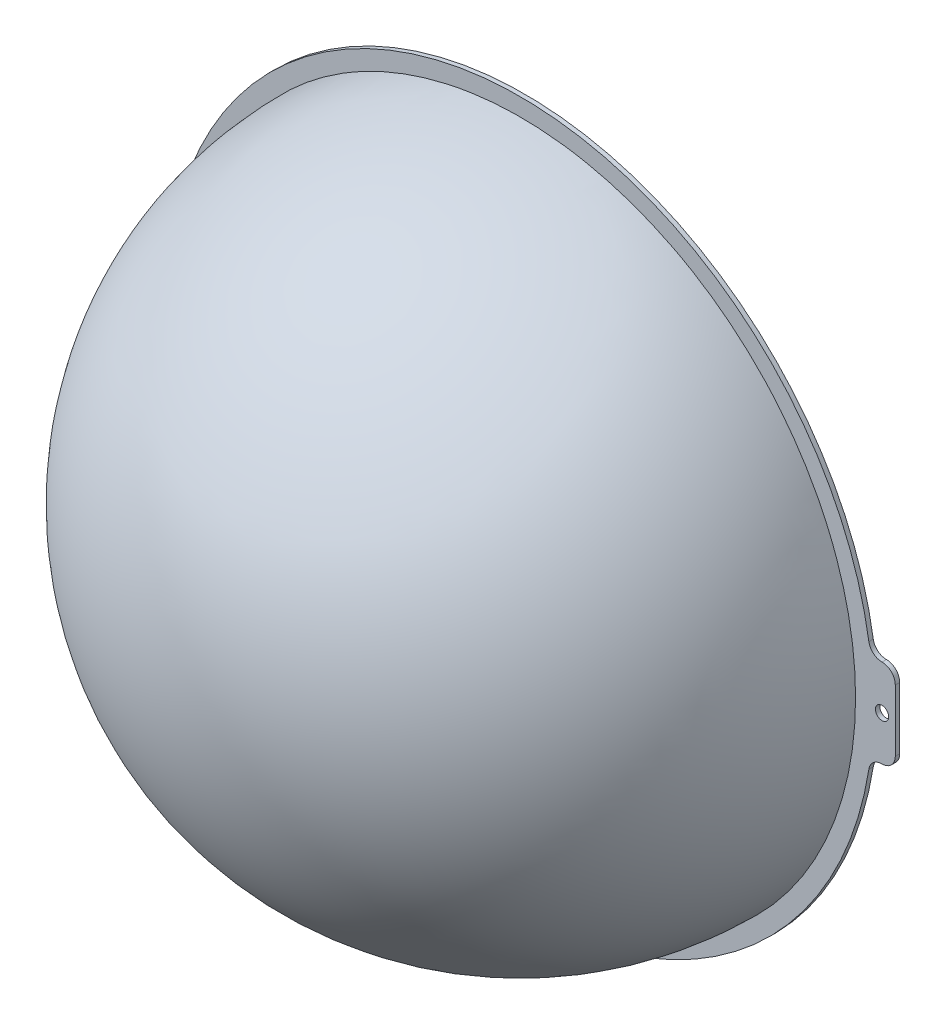
ISO-10303-21;
HEADER;
FILE_DESCRIPTION(('STEP AP214'),'2;1');
FILE_NAME('part.step','',(''),(''),'','','');
FILE_SCHEMA(('AUTOMOTIVE_DESIGN { 1 0 10303 214 1 1 1 1 }'));
ENDSEC;
DATA;
#1=APPLICATION_CONTEXT('core data for automotive mechanical design processes');
#2=APPLICATION_PROTOCOL_DEFINITION('international standard','automotive_design',2000,#1);
#3=PRODUCT_CONTEXT('',#1,'mechanical');
#4=PRODUCT('Part','Part','',(#3));
#5=PRODUCT_RELATED_PRODUCT_CATEGORY('part','',(#4));
#6=PRODUCT_DEFINITION_FORMATION('','',#4);
#7=PRODUCT_DEFINITION_CONTEXT('part definition',#1,'design');
#8=PRODUCT_DEFINITION('design','',#6,#7);
#9=PRODUCT_DEFINITION_SHAPE('','',#8);
#10=(LENGTH_UNIT() NAMED_UNIT(*) SI_UNIT(.MILLI.,.METRE.));
#11=(NAMED_UNIT(*) PLANE_ANGLE_UNIT() SI_UNIT($,.RADIAN.));
#12=(NAMED_UNIT(*) SI_UNIT($,.STERADIAN.) SOLID_ANGLE_UNIT());
#13=UNCERTAINTY_MEASURE_WITH_UNIT(LENGTH_MEASURE(1.E-05),#10,'distance_accuracy_value','');
#14=(GEOMETRIC_REPRESENTATION_CONTEXT(3) GLOBAL_UNCERTAINTY_ASSIGNED_CONTEXT((#13)) GLOBAL_UNIT_ASSIGNED_CONTEXT((#10,
#11,#12)) REPRESENTATION_CONTEXT('',''));
#15=CARTESIAN_POINT('',(0.,0.,0.));
#16=DIRECTION('',(0.,0.,1.));
#17=DIRECTION('',(1.,0.,0.));
#18=AXIS2_PLACEMENT_3D('',#15,#16,#17);
#19=CARTESIAN_POINT('',(-4.547474E-13,667.332012286218,-368.857743681072));
#20=DIRECTION('',(-1.,0.,0.));
#21=DIRECTION('',(0.,-1.,0.));
#22=AXIS2_PLACEMENT_3D('',#19,#20,#21);
#23=SPHERICAL_SURFACE('',#22,75.);
#24=CARTESIAN_POINT('',(-4.547474E-13,667.332012286218,-368.857743681072));
#25=DIRECTION('',(0.,0.,1.));
#26=DIRECTION('',(1.,0.,0.));
#27=AXIS2_PLACEMENT_3D('',#24,#25,#26);
#28=CIRCLE('',#27,75.);
#29=CARTESIAN_POINT('',(74.9999999999995,667.332012286218,-368.857743681072));
#30=VERTEX_POINT('',#29);
#31=CARTESIAN_POINT('',(-75.0000000000005,667.332012286218,-368.857743681072));
#32=VERTEX_POINT('',#31);
#33=EDGE_CURVE('E216',#30,#32,#28,.F.);
#34=ORIENTED_EDGE('',*,*,#33,.T.);
#35=CARTESIAN_POINT('',(-4.547474E-13,667.332012286218,-368.857743681072));
#36=DIRECTION('',(0.,0.,1.));
#37=DIRECTION('',(1.,0.,0.));
#38=AXIS2_PLACEMENT_3D('',#35,#36,#37);
#39=CIRCLE('',#38,75.);
#40=EDGE_CURVE('E213',#32,#30,#39,.F.);
#41=ORIENTED_EDGE('',*,*,#40,.T.);
#42=EDGE_LOOP('',(#34,#41));
#43=FACE_BOUND('',#42,.T.);
#44=ADVANCED_FACE('F17',(#43),#23,.F.);
#45=CARTESIAN_POINT('',(-4.547474E-13,667.332012286218,-369.357743681072));
#46=DIRECTION('',(0.,0.,1.));
#47=DIRECTION('',(1.,0.,0.));
#48=AXIS2_PLACEMENT_3D('',#45,#46,#47);
#49=CYLINDRICAL_SURFACE('',#48,75.);
#50=CARTESIAN_POINT('',(-4.547474E-13,667.332012286218,-369.857743681072));
#51=DIRECTION('',(0.,0.,1.));
#52=DIRECTION('',(1.,0.,0.));
#53=AXIS2_PLACEMENT_3D('',#50,#51,#52);
#54=CIRCLE('',#53,75.);
#55=CARTESIAN_POINT('',(74.9999999999995,667.332012286218,-369.857743681072));
#56=VERTEX_POINT('',#55);
#57=EDGE_CURVE('E21',#56,#56,#54,.T.);
#58=ORIENTED_EDGE('',*,*,#57,.F.);
#59=EDGE_LOOP('',(#58));
#60=FACE_BOUND('',#59,.T.);
#61=ORIENTED_EDGE('',*,*,#40,.F.);
#62=ORIENTED_EDGE('',*,*,#33,.F.);
#63=EDGE_LOOP('',(#61,#62));
#64=FACE_BOUND('',#63,.T.);
#65=ADVANCED_FACE('F312',(#60,#64),#49,.F.);
#66=CARTESIAN_POINT('',(-4.547474E-13,667.332012286218,-369.857743681072));
#67=DIRECTION('',(0.,0.,-1.));
#68=DIRECTION('',(-1.,0.,0.));
#69=AXIS2_PLACEMENT_3D('',#66,#67,#68);
#70=PLANE('',#69);
#71=CARTESIAN_POINT('',(-82.0000000000005,667.332012286217,-369.857743681072));
#72=DIRECTION('',(0.,0.,1.));
#73=DIRECTION('',(1.,0.,0.));
#74=AXIS2_PLACEMENT_3D('',#71,#72,#73);
#75=CIRCLE('',#74,1.5);
#76=CARTESIAN_POINT('',(-80.5000000000005,667.332012286217,-369.857743681072));
#77=VERTEX_POINT('',#76);
#78=EDGE_CURVE('E390',#77,#77,#75,.T.);
#79=ORIENTED_EDGE('',*,*,#78,.T.);
#80=EDGE_LOOP('',(#79));
#81=FACE_BOUND('',#80,.T.);
#82=ORIENTED_EDGE('',*,*,#57,.T.);
#83=EDGE_LOOP('',(#82));
#84=FACE_BOUND('',#83,.T.);
#85=CARTESIAN_POINT('',(81.9999999999995,667.332012286217,-369.857743681072));
#86=DIRECTION('',(0.,0.,1.));
#87=DIRECTION('',(1.,0.,0.));
#88=AXIS2_PLACEMENT_3D('',#85,#86,#87);
#89=CIRCLE('',#88,1.5);
#90=CARTESIAN_POINT('',(83.4999999999995,667.332012286217,-369.857743681072));
#91=VERTEX_POINT('',#90);
#92=EDGE_CURVE('E160',#91,#91,#89,.T.);
#93=ORIENTED_EDGE('',*,*,#92,.T.);
#94=EDGE_LOOP('',(#93));
#95=FACE_BOUND('',#94,.T.);
#96=DIRECTION('',(1.,0.,0.));
#97=VECTOR('',#96,1.);
#98=CARTESIAN_POINT('',(79.9999999999995,657.332012286217,-369.857743681072));
#99=LINE('',#98,#97);
#100=CARTESIAN_POINT('',(81.9999999999995,657.332012286217,-369.857743681072));
#101=VERTEX_POINT('',#100);
#102=CARTESIAN_POINT('',(81.9756061276763,657.332012286217,-369.857743681072));
#103=VERTEX_POINT('',#102);
#104=EDGE_CURVE('E178',#101,#103,#99,.F.);
#105=ORIENTED_EDGE('',*,*,#104,.T.);
#106=CARTESIAN_POINT('',(81.9756061276763,654.332012286217,-369.857743681072));
#107=DIRECTION('',(0.,0.,1.));
#108=DIRECTION('',(1.,0.,0.));
#109=AXIS2_PLACEMENT_3D('',#106,#107,#108);
#110=CIRCLE('',#109,3.);
#111=CARTESIAN_POINT('',(79.0126324122182,654.80189180429,-369.857743681072));
#112=VERTEX_POINT('',#111);
#113=EDGE_CURVE('E175',#103,#112,#110,.T.);
#114=ORIENTED_EDGE('',*,*,#113,.T.);
#115=CARTESIAN_POINT('',(-4.547474E-13,667.332012286218,-369.857743681072));
#116=DIRECTION('',(0.,0.,1.));
#117=DIRECTION('',(1.,0.,0.));
#118=AXIS2_PLACEMENT_3D('',#115,#116,#117);
#119=CIRCLE('',#118,80.);
#120=CARTESIAN_POINT('',(-79.012632412219,654.80189180429,-369.857743681072));
#121=VERTEX_POINT('',#120);
#122=EDGE_CURVE('E180',#121,#112,#119,.T.);
#123=ORIENTED_EDGE('',*,*,#122,.F.);
#124=CARTESIAN_POINT('',(-81.9756061276772,654.332012286217,-369.857743681072));
#125=DIRECTION('',(0.,0.,-1.));
#126=DIRECTION('',(-1.,0.,0.));
#127=AXIS2_PLACEMENT_3D('',#124,#125,#126);
#128=CIRCLE('',#127,3.);
#129=CARTESIAN_POINT('',(-81.9756061276772,657.332012286217,-369.857743681072));
#130=VERTEX_POINT('',#129);
#131=EDGE_CURVE('E183',#121,#130,#128,.F.);
#132=ORIENTED_EDGE('',*,*,#131,.T.);
#133=DIRECTION('',(1.,0.,0.));
#134=VECTOR('',#133,1.);
#135=CARTESIAN_POINT('',(-81.9756061276772,657.332012286217,-369.857743681072));
#136=LINE('',#135,#134);
#137=CARTESIAN_POINT('',(-82.0000000000005,657.332012286217,-369.857743681072));
#138=VERTEX_POINT('',#137);
#139=EDGE_CURVE('E190',#130,#138,#136,.F.);
#140=ORIENTED_EDGE('',*,*,#139,.T.);
#141=CARTESIAN_POINT('',(-82.0000000000005,660.332012286217,-369.857743681072));
#142=DIRECTION('',(0.,0.,1.));
#143=DIRECTION('',(1.,0.,0.));
#144=AXIS2_PLACEMENT_3D('',#141,#142,#143);
#145=CIRCLE('',#144,3.);
#146=CARTESIAN_POINT('',(-85.0000000000005,660.332012286217,-369.857743681072));
#147=VERTEX_POINT('',#146);
#148=EDGE_CURVE('E187',#147,#138,#145,.T.);
#149=ORIENTED_EDGE('',*,*,#148,.F.);
#150=DIRECTION('',(0.,1.,0.));
#151=VECTOR('',#150,1.);
#152=CARTESIAN_POINT('',(-85.0000000000005,660.332012286217,-369.857743681072));
#153=LINE('',#152,#151);
#154=CARTESIAN_POINT('',(-85.0000000000005,674.332012286217,-369.857743681072));
#155=VERTEX_POINT('',#154);
#156=EDGE_CURVE('E210',#147,#155,#153,.T.);
#157=ORIENTED_EDGE('',*,*,#156,.T.);
#158=CARTESIAN_POINT('',(-82.0000000000005,674.332012286217,-369.857743681072));
#159=DIRECTION('',(0.,0.,-1.));
#160=DIRECTION('',(-1.,0.,0.));
#161=AXIS2_PLACEMENT_3D('',#158,#159,#160);
#162=CIRCLE('',#161,3.);
#163=CARTESIAN_POINT('',(-82.0000000000005,677.332012286217,-369.857743681072));
#164=VERTEX_POINT('',#163);
#165=EDGE_CURVE('E192',#164,#155,#162,.F.);
#166=ORIENTED_EDGE('',*,*,#165,.F.);
#167=DIRECTION('',(1.,0.,0.));
#168=VECTOR('',#167,1.);
#169=CARTESIAN_POINT('',(-81.9756061276773,677.332012286217,-369.857743681072));
#170=LINE('',#169,#168);
#171=CARTESIAN_POINT('',(-81.9756061276773,677.332012286217,-369.857743681072));
#172=VERTEX_POINT('',#171);
#173=EDGE_CURVE('E197',#164,#172,#170,.T.);
#174=ORIENTED_EDGE('',*,*,#173,.T.);
#175=CARTESIAN_POINT('',(-81.9756061276773,680.332012286217,-369.857743681072));
#176=DIRECTION('',(0.,0.,1.));
#177=DIRECTION('',(1.,0.,0.));
#178=AXIS2_PLACEMENT_3D('',#175,#176,#177);
#179=CIRCLE('',#178,3.);
#180=CARTESIAN_POINT('',(-79.0126324122191,679.862132768145,-369.857743681072));
#181=VERTEX_POINT('',#180);
#182=EDGE_CURVE('E142',#172,#181,#179,.T.);
#183=ORIENTED_EDGE('',*,*,#182,.T.);
#184=CARTESIAN_POINT('',(-4.547474E-13,667.332012286218,-369.857743681072));
#185=DIRECTION('',(0.,0.,1.));
#186=DIRECTION('',(1.,0.,0.));
#187=AXIS2_PLACEMENT_3D('',#184,#185,#186);
#188=CIRCLE('',#187,80.);
#189=CARTESIAN_POINT('',(79.0126324122181,679.862132768145,-369.857743681072));
#190=VERTEX_POINT('',#189);
#191=EDGE_CURVE('E135',#190,#181,#188,.T.);
#192=ORIENTED_EDGE('',*,*,#191,.F.);
#193=CARTESIAN_POINT('',(81.9756061276763,680.332012286217,-369.857743681072));
#194=DIRECTION('',(0.,0.,-1.));
#195=DIRECTION('',(-1.,0.,0.));
#196=AXIS2_PLACEMENT_3D('',#193,#194,#195);
#197=CIRCLE('',#196,3.);
#198=CARTESIAN_POINT('',(81.9756061276763,677.332012286217,-369.857743681072));
#199=VERTEX_POINT('',#198);
#200=EDGE_CURVE('E139',#190,#199,#197,.F.);
#201=ORIENTED_EDGE('',*,*,#200,.T.);
#202=DIRECTION('',(1.,0.,0.));
#203=VECTOR('',#202,1.);
#204=CARTESIAN_POINT('',(79.9999999999995,677.332012286217,-369.857743681072));
#205=LINE('',#204,#203);
#206=CARTESIAN_POINT('',(81.9999999999995,677.332012286217,-369.857743681072));
#207=VERTEX_POINT('',#206);
#208=EDGE_CURVE('E204',#199,#207,#205,.T.);
#209=ORIENTED_EDGE('',*,*,#208,.T.);
#210=CARTESIAN_POINT('',(81.9999999999995,674.332012286217,-369.857743681072));
#211=DIRECTION('',(0.,0.,-1.));
#212=DIRECTION('',(-1.,0.,0.));
#213=AXIS2_PLACEMENT_3D('',#210,#211,#212);
#214=CIRCLE('',#213,3.);
#215=CARTESIAN_POINT('',(84.9999999999995,674.332012286217,-369.857743681072));
#216=VERTEX_POINT('',#215);
#217=EDGE_CURVE('E165',#216,#207,#214,.F.);
#218=ORIENTED_EDGE('',*,*,#217,.F.);
#219=DIRECTION('',(0.,1.,0.));
#220=VECTOR('',#219,1.);
#221=CARTESIAN_POINT('',(84.9999999999995,667.332012286217,-369.857743681072));
#222=LINE('',#221,#220);
#223=CARTESIAN_POINT('',(84.9999999999995,660.332012286217,-369.857743681072));
#224=VERTEX_POINT('',#223);
#225=EDGE_CURVE('E173',#216,#224,#222,.F.);
#226=ORIENTED_EDGE('',*,*,#225,.T.);
#227=CARTESIAN_POINT('',(81.9999999999995,660.332012286217,-369.857743681072));
#228=DIRECTION('',(0.,0.,1.));
#229=DIRECTION('',(0.,-1.,0.));
#230=AXIS2_PLACEMENT_3D('',#227,#228,#229);
#231=CIRCLE('',#230,3.00000000000002);
#232=EDGE_CURVE('E170',#101,#224,#231,.T.);
#233=ORIENTED_EDGE('',*,*,#232,.F.);
#234=EDGE_LOOP('',(#105,#114,#123,#132,#140,#149,#157,#166,#174,#183,#192,#201,#209,#218,#226,#233));
#235=FACE_BOUND('',#234,.T.);
#236=ADVANCED_FACE('F137',(#81,#84,#95,#235),#70,.T.);
#237=CARTESIAN_POINT('',(-4.547474E-13,667.332012286218,-369.357743681072));
#238=DIRECTION('',(0.,0.,1.));
#239=DIRECTION('',(1.,0.,0.));
#240=AXIS2_PLACEMENT_3D('',#237,#238,#239);
#241=CYLINDRICAL_SURFACE('',#240,80.);
#242=DIRECTION('',(0.,0.,1.));
#243=VECTOR('',#242,1.);
#244=CARTESIAN_POINT('',(-79.0126324122191,679.862132768145,-369.357743681072));
#245=LINE('',#244,#243);
#246=CARTESIAN_POINT('',(-79.0126324122191,679.862132768145,-368.857743681072));
#247=VERTEX_POINT('',#246);
#248=EDGE_CURVE('E145',#181,#247,#245,.T.);
#249=ORIENTED_EDGE('',*,*,#248,.T.);
#250=CARTESIAN_POINT('',(-4.547474E-13,667.332012286218,-368.857743681072));
#251=DIRECTION('',(0.,0.,1.));
#252=DIRECTION('',(1.,0.,0.));
#253=AXIS2_PLACEMENT_3D('',#250,#251,#252);
#254=CIRCLE('',#253,80.);
#255=CARTESIAN_POINT('',(79.0126324122181,679.862132768145,-368.857743681072));
#256=VERTEX_POINT('',#255);
#257=EDGE_CURVE('E150',#256,#247,#254,.T.);
#258=ORIENTED_EDGE('',*,*,#257,.F.);
#259=DIRECTION('',(0.,0.,-1.));
#260=VECTOR('',#259,1.);
#261=CARTESIAN_POINT('',(79.0126324122181,679.862132768145,-369.357743681072));
#262=LINE('',#261,#260);
#263=EDGE_CURVE('E147',#256,#190,#262,.T.);
#264=ORIENTED_EDGE('',*,*,#263,.T.);
#265=ORIENTED_EDGE('',*,*,#191,.T.);
#266=EDGE_LOOP('',(#249,#258,#264,#265));
#267=FACE_BOUND('',#266,.T.);
#268=ADVANCED_FACE('F148',(#267),#241,.T.);
#269=CARTESIAN_POINT('',(-81.9756061276773,680.332012286217,-369.357743681072));
#270=DIRECTION('',(0.,0.,1.));
#271=DIRECTION('',(1.,0.,0.));
#272=AXIS2_PLACEMENT_3D('',#269,#270,#271);
#273=CYLINDRICAL_SURFACE('',#272,3.);
#274=DIRECTION('',(0.,0.,-1.));
#275=VECTOR('',#274,1.);
#276=CARTESIAN_POINT('',(-81.9756061276773,677.332012286217,-369.857743681072));
#277=LINE('',#276,#275);
#278=CARTESIAN_POINT('',(-81.9756061276773,677.332012286217,-368.857743681072));
#279=VERTEX_POINT('',#278);
#280=EDGE_CURVE('E196',#172,#279,#277,.F.);
#281=ORIENTED_EDGE('',*,*,#280,.T.);
#282=CARTESIAN_POINT('',(-81.9756061276773,680.332012286217,-368.857743681072));
#283=DIRECTION('',(0.,0.,1.));
#284=DIRECTION('',(1.,0.,0.));
#285=AXIS2_PLACEMENT_3D('',#282,#283,#284);
#286=CIRCLE('',#285,3.);
#287=EDGE_CURVE('E362',#247,#279,#286,.F.);
#288=ORIENTED_EDGE('',*,*,#287,.F.);
#289=ORIENTED_EDGE('',*,*,#248,.F.);
#290=ORIENTED_EDGE('',*,*,#182,.F.);
#291=EDGE_LOOP('',(#281,#288,#289,#290));
#292=FACE_BOUND('',#291,.T.);
#293=ADVANCED_FACE('F304',(#292),#273,.F.);
#294=CARTESIAN_POINT('',(-81.9756061276773,677.332012286217,-369.857743681072));
#295=DIRECTION('',(0.,-1.,0.));
#296=DIRECTION('',(0.,0.,-1.));
#297=AXIS2_PLACEMENT_3D('',#294,#295,#296);
#298=PLANE('',#297);
#299=ORIENTED_EDGE('',*,*,#173,.F.);
#300=DIRECTION('',(0.,0.,-1.));
#301=VECTOR('',#300,1.);
#302=CARTESIAN_POINT('',(-82.0000000000005,677.332012286217,-369.107743681072));
#303=LINE('',#302,#301);
#304=CARTESIAN_POINT('',(-82.0000000000005,677.332012286217,-368.857743681072));
#305=VERTEX_POINT('',#304);
#306=EDGE_CURVE('E195',#305,#164,#303,.T.);
#307=ORIENTED_EDGE('',*,*,#306,.F.);
#308=DIRECTION('',(1.,0.,0.));
#309=VECTOR('',#308,1.);
#310=CARTESIAN_POINT('',(-4.547474E-13,677.332012286217,-368.857743681072));
#311=LINE('',#310,#309);
#312=EDGE_CURVE('E360',#279,#305,#311,.F.);
#313=ORIENTED_EDGE('',*,*,#312,.F.);
#314=ORIENTED_EDGE('',*,*,#280,.F.);
#315=EDGE_LOOP('',(#299,#307,#313,#314));
#316=FACE_BOUND('',#315,.T.);
#317=ADVANCED_FACE('F300',(#316),#298,.F.);
#318=CARTESIAN_POINT('',(-82.0000000000005,674.332012286217,-369.107743681072));
#319=DIRECTION('',(0.,0.,-1.));
#320=DIRECTION('',(-1.,0.,0.));
#321=AXIS2_PLACEMENT_3D('',#318,#319,#320);
#322=CYLINDRICAL_SURFACE('',#321,3.);
#323=CARTESIAN_POINT('',(-82.0000000000005,674.332012286217,-368.857743681072));
#324=DIRECTION('',(0.,0.,-1.));
#325=DIRECTION('',(-1.,0.,0.));
#326=AXIS2_PLACEMENT_3D('',#323,#324,#325);
#327=CIRCLE('',#326,3.);
#328=CARTESIAN_POINT('',(-85.0000000000005,674.332012286217,-368.857743681072));
#329=VERTEX_POINT('',#328);
#330=EDGE_CURVE('E359',#305,#329,#327,.F.);
#331=ORIENTED_EDGE('',*,*,#330,.F.);
#332=ORIENTED_EDGE('',*,*,#306,.T.);
#333=ORIENTED_EDGE('',*,*,#165,.T.);
#334=DIRECTION('',(0.,0.,-1.));
#335=VECTOR('',#334,1.);
#336=CARTESIAN_POINT('',(-85.0000000000005,674.332012286217,-368.857743681072));
#337=LINE('',#336,#335);
#338=EDGE_CURVE('E211',#155,#329,#337,.F.);
#339=ORIENTED_EDGE('',*,*,#338,.T.);
#340=EDGE_LOOP('',(#331,#332,#333,#339));
#341=FACE_BOUND('',#340,.T.);
#342=ADVANCED_FACE('F296',(#341),#322,.T.);
#343=CARTESIAN_POINT('',(-85.0000000000005,660.332012286217,-368.857743681072));
#344=DIRECTION('',(1.,0.,0.));
#345=DIRECTION('',(0.,0.,-1.));
#346=AXIS2_PLACEMENT_3D('',#343,#344,#345);
#347=PLANE('',#346);
#348=DIRECTION('',(0.,1.,0.));
#349=VECTOR('',#348,1.);
#350=CARTESIAN_POINT('',(-85.0000000000005,667.332012286218,-368.857743681072));
#351=LINE('',#350,#349);
#352=CARTESIAN_POINT('',(-85.0000000000005,660.332012286217,-368.857743681072));
#353=VERTEX_POINT('',#352);
#354=EDGE_CURVE('E356',#329,#353,#351,.F.);
#355=ORIENTED_EDGE('',*,*,#354,.F.);
#356=ORIENTED_EDGE('',*,*,#338,.F.);
#357=ORIENTED_EDGE('',*,*,#156,.F.);
#358=DIRECTION('',(0.,0.,1.));
#359=VECTOR('',#358,1.);
#360=CARTESIAN_POINT('',(-85.0000000000005,660.332012286217,-369.107743681072));
#361=LINE('',#360,#359);
#362=EDGE_CURVE('E191',#353,#147,#361,.F.);
#363=ORIENTED_EDGE('',*,*,#362,.F.);
#364=EDGE_LOOP('',(#355,#356,#357,#363));
#365=FACE_BOUND('',#364,.T.);
#366=ADVANCED_FACE('F292',(#365),#347,.F.);
#367=CARTESIAN_POINT('',(-82.0000000000005,660.332012286217,-369.107743681072));
#368=DIRECTION('',(0.,0.,1.));
#369=DIRECTION('',(1.,0.,0.));
#370=AXIS2_PLACEMENT_3D('',#367,#368,#369);
#371=CYLINDRICAL_SURFACE('',#370,3.);
#372=ORIENTED_EDGE('',*,*,#148,.T.);
#373=DIRECTION('',(0.,0.,1.));
#374=VECTOR('',#373,1.);
#375=CARTESIAN_POINT('',(-82.0000000000005,657.332012286217,-368.857743681072));
#376=LINE('',#375,#374);
#377=CARTESIAN_POINT('',(-82.0000000000005,657.332012286217,-368.857743681072));
#378=VERTEX_POINT('',#377);
#379=EDGE_CURVE('E186',#138,#378,#376,.T.);
#380=ORIENTED_EDGE('',*,*,#379,.T.);
#381=CARTESIAN_POINT('',(-82.0000000000005,660.332012286217,-368.857743681072));
#382=DIRECTION('',(0.,0.,1.));
#383=DIRECTION('',(1.,0.,0.));
#384=AXIS2_PLACEMENT_3D('',#381,#382,#383);
#385=CIRCLE('',#384,3.);
#386=EDGE_CURVE('E355',#353,#378,#385,.T.);
#387=ORIENTED_EDGE('',*,*,#386,.F.);
#388=ORIENTED_EDGE('',*,*,#362,.T.);
#389=EDGE_LOOP('',(#372,#380,#387,#388));
#390=FACE_BOUND('',#389,.T.);
#391=ADVANCED_FACE('F288',(#390),#371,.T.);
#392=CARTESIAN_POINT('',(-81.9756061276772,657.332012286217,-368.857743681072));
#393=DIRECTION('',(0.,1.,0.));
#394=DIRECTION('',(0.,0.,1.));
#395=AXIS2_PLACEMENT_3D('',#392,#393,#394);
#396=PLANE('',#395);
#397=DIRECTION('',(1.,0.,0.));
#398=VECTOR('',#397,1.);
#399=CARTESIAN_POINT('',(-4.547474E-13,657.332012286217,-368.857743681072));
#400=LINE('',#399,#398);
#401=CARTESIAN_POINT('',(-81.9756061276772,657.332012286217,-368.857743681072));
#402=VERTEX_POINT('',#401);
#403=EDGE_CURVE('E351',#378,#402,#400,.T.);
#404=ORIENTED_EDGE('',*,*,#403,.F.);
#405=ORIENTED_EDGE('',*,*,#379,.F.);
#406=ORIENTED_EDGE('',*,*,#139,.F.);
#407=DIRECTION('',(0.,0.,-1.));
#408=VECTOR('',#407,1.);
#409=CARTESIAN_POINT('',(-81.9756061276772,657.332012286217,-369.357743681072));
#410=LINE('',#409,#408);
#411=EDGE_CURVE('E185',#130,#402,#410,.F.);
#412=ORIENTED_EDGE('',*,*,#411,.T.);
#413=EDGE_LOOP('',(#404,#405,#406,#412));
#414=FACE_BOUND('',#413,.T.);
#415=ADVANCED_FACE('F284',(#414),#396,.F.);
#416=CARTESIAN_POINT('',(-81.9756061276772,654.332012286217,-369.357743681072));
#417=DIRECTION('',(0.,0.,-1.));
#418=DIRECTION('',(-1.,0.,0.));
#419=AXIS2_PLACEMENT_3D('',#416,#417,#418);
#420=CYLINDRICAL_SURFACE('',#419,3.);
#421=ORIENTED_EDGE('',*,*,#411,.F.);
#422=ORIENTED_EDGE('',*,*,#131,.F.);
#423=DIRECTION('',(0.,0.,1.));
#424=VECTOR('',#423,1.);
#425=CARTESIAN_POINT('',(-79.012632412219,654.80189180429,-369.357743681072));
#426=LINE('',#425,#424);
#427=CARTESIAN_POINT('',(-79.012632412219,654.80189180429,-368.857743681072));
#428=VERTEX_POINT('',#427);
#429=EDGE_CURVE('E182',#428,#121,#426,.F.);
#430=ORIENTED_EDGE('',*,*,#429,.F.);
#431=CARTESIAN_POINT('',(-81.9756061276772,654.332012286217,-368.857743681072));
#432=DIRECTION('',(0.,0.,-1.));
#433=DIRECTION('',(-1.,0.,0.));
#434=AXIS2_PLACEMENT_3D('',#431,#432,#433);
#435=CIRCLE('',#434,3.);
#436=EDGE_CURVE('E354',#402,#428,#435,.T.);
#437=ORIENTED_EDGE('',*,*,#436,.F.);
#438=EDGE_LOOP('',(#421,#422,#430,#437));
#439=FACE_BOUND('',#438,.T.);
#440=ADVANCED_FACE('F280',(#439),#420,.F.);
#441=CARTESIAN_POINT('',(-4.547474E-13,667.332012286218,-369.357743681072));
#442=DIRECTION('',(0.,0.,1.));
#443=DIRECTION('',(1.,0.,0.));
#444=AXIS2_PLACEMENT_3D('',#441,#442,#443);
#445=CYLINDRICAL_SURFACE('',#444,80.);
#446=ORIENTED_EDGE('',*,*,#429,.T.);
#447=ORIENTED_EDGE('',*,*,#122,.T.);
#448=DIRECTION('',(0.,0.,1.));
#449=VECTOR('',#448,1.);
#450=CARTESIAN_POINT('',(79.0126324122182,654.80189180429,-369.357743681072));
#451=LINE('',#450,#449);
#452=CARTESIAN_POINT('',(79.0126324122182,654.80189180429,-368.857743681072));
#453=VERTEX_POINT('',#452);
#454=EDGE_CURVE('E179',#112,#453,#451,.T.);
#455=ORIENTED_EDGE('',*,*,#454,.T.);
#456=CARTESIAN_POINT('',(-4.547474E-13,667.332012286218,-368.857743681072));
#457=DIRECTION('',(0.,0.,1.));
#458=DIRECTION('',(1.,0.,0.));
#459=AXIS2_PLACEMENT_3D('',#456,#457,#458);
#460=CIRCLE('',#459,80.);
#461=EDGE_CURVE('E399',#428,#453,#460,.T.);
#462=ORIENTED_EDGE('',*,*,#461,.F.);
#463=EDGE_LOOP('',(#446,#447,#455,#462));
#464=FACE_BOUND('',#463,.T.);
#465=ADVANCED_FACE('F276',(#464),#445,.T.);
#466=CARTESIAN_POINT('',(81.9756061276763,654.332012286217,-369.357743681072));
#467=DIRECTION('',(0.,0.,1.));
#468=DIRECTION('',(1.,0.,0.));
#469=AXIS2_PLACEMENT_3D('',#466,#467,#468);
#470=CYLINDRICAL_SURFACE('',#469,3.);
#471=DIRECTION('',(0.,0.,1.));
#472=VECTOR('',#471,1.);
#473=CARTESIAN_POINT('',(81.9756061276763,657.332012286217,-369.107743681072));
#474=LINE('',#473,#472);
#475=CARTESIAN_POINT('',(81.9756061276763,657.332012286217,-368.857743681072));
#476=VERTEX_POINT('',#475);
#477=EDGE_CURVE('E208',#103,#476,#474,.T.);
#478=ORIENTED_EDGE('',*,*,#477,.T.);
#479=CARTESIAN_POINT('',(81.9756061276763,654.332012286217,-368.857743681072));
#480=DIRECTION('',(0.,0.,1.));
#481=DIRECTION('',(1.,0.,0.));
#482=AXIS2_PLACEMENT_3D('',#479,#480,#481);
#483=CIRCLE('',#482,3.);
#484=EDGE_CURVE('E350',#453,#476,#483,.F.);
#485=ORIENTED_EDGE('',*,*,#484,.F.);
#486=ORIENTED_EDGE('',*,*,#454,.F.);
#487=ORIENTED_EDGE('',*,*,#113,.F.);
#488=EDGE_LOOP('',(#478,#485,#486,#487));
#489=FACE_BOUND('',#488,.T.);
#490=ADVANCED_FACE('F272',(#489),#470,.F.);
#491=CARTESIAN_POINT('',(79.9999999999995,657.332012286217,-369.107743681072));
#492=DIRECTION('',(0.,1.,0.));
#493=DIRECTION('',(0.,0.,1.));
#494=AXIS2_PLACEMENT_3D('',#491,#492,#493);
#495=PLANE('',#494);
#496=ORIENTED_EDGE('',*,*,#104,.F.);
#497=DIRECTION('',(0.,0.,1.));
#498=VECTOR('',#497,1.);
#499=CARTESIAN_POINT('',(81.9999999999995,657.332012286217,-369.857743681072));
#500=LINE('',#499,#498);
#501=CARTESIAN_POINT('',(81.9999999999995,657.332012286217,-368.857743681072));
#502=VERTEX_POINT('',#501);
#503=EDGE_CURVE('E174',#502,#101,#500,.F.);
#504=ORIENTED_EDGE('',*,*,#503,.F.);
#505=DIRECTION('',(1.,0.,0.));
#506=VECTOR('',#505,1.);
#507=CARTESIAN_POINT('',(-4.547474E-13,657.332012286217,-368.857743681072));
#508=LINE('',#507,#506);
#509=EDGE_CURVE('E347',#476,#502,#508,.T.);
#510=ORIENTED_EDGE('',*,*,#509,.F.);
#511=ORIENTED_EDGE('',*,*,#477,.F.);
#512=EDGE_LOOP('',(#496,#504,#510,#511));
#513=FACE_BOUND('',#512,.T.);
#514=ADVANCED_FACE('F268',(#513),#495,.F.);
#515=CARTESIAN_POINT('',(81.9999999999995,660.332012286217,-369.857743681072));
#516=DIRECTION('',(0.,0.,1.));
#517=DIRECTION('',(0.,-1.,0.));
#518=AXIS2_PLACEMENT_3D('',#515,#516,#517);
#519=CYLINDRICAL_SURFACE('',#518,3.00000000000002);
#520=ORIENTED_EDGE('',*,*,#232,.T.);
#521=DIRECTION('',(0.,0.,1.));
#522=VECTOR('',#521,1.);
#523=CARTESIAN_POINT('',(84.9999999999995,660.332012286217,-369.107743681072));
#524=LINE('',#523,#522);
#525=CARTESIAN_POINT('',(84.9999999999995,660.332012286217,-368.857743681072));
#526=VERTEX_POINT('',#525);
#527=EDGE_CURVE('E169',#224,#526,#524,.T.);
#528=ORIENTED_EDGE('',*,*,#527,.T.);
#529=CARTESIAN_POINT('',(81.9999999999995,660.332012286217,-368.857743681072));
#530=DIRECTION('',(0.,0.,1.));
#531=DIRECTION('',(0.,-1.,0.));
#532=AXIS2_PLACEMENT_3D('',#529,#530,#531);
#533=CIRCLE('',#532,3.00000000000002);
#534=EDGE_CURVE('E346',#502,#526,#533,.T.);
#535=ORIENTED_EDGE('',*,*,#534,.F.);
#536=ORIENTED_EDGE('',*,*,#503,.T.);
#537=EDGE_LOOP('',(#520,#528,#535,#536));
#538=FACE_BOUND('',#537,.T.);
#539=ADVANCED_FACE('F264',(#538),#519,.T.);
#540=CARTESIAN_POINT('',(84.9999999999995,667.332012286217,-369.107743681072));
#541=DIRECTION('',(-1.,0.,0.));
#542=DIRECTION('',(0.,0.,1.));
#543=AXIS2_PLACEMENT_3D('',#540,#541,#542);
#544=PLANE('',#543);
#545=ORIENTED_EDGE('',*,*,#225,.F.);
#546=DIRECTION('',(0.,0.,-1.));
#547=VECTOR('',#546,1.);
#548=CARTESIAN_POINT('',(84.9999999999995,674.332012286217,-368.857743681072));
#549=LINE('',#548,#547);
#550=CARTESIAN_POINT('',(84.9999999999995,674.332012286217,-368.857743681072));
#551=VERTEX_POINT('',#550);
#552=EDGE_CURVE('E168',#551,#216,#549,.T.);
#553=ORIENTED_EDGE('',*,*,#552,.F.);
#554=DIRECTION('',(0.,1.,0.));
#555=VECTOR('',#554,1.);
#556=CARTESIAN_POINT('',(84.9999999999995,667.332012286218,-368.857743681072));
#557=LINE('',#556,#555);
#558=EDGE_CURVE('E341',#526,#551,#557,.T.);
#559=ORIENTED_EDGE('',*,*,#558,.F.);
#560=ORIENTED_EDGE('',*,*,#527,.F.);
#561=EDGE_LOOP('',(#545,#553,#559,#560));
#562=FACE_BOUND('',#561,.T.);
#563=ADVANCED_FACE('F260',(#562),#544,.F.);
#564=CARTESIAN_POINT('',(81.9999999999995,674.332012286217,-368.857743681072));
#565=DIRECTION('',(0.,0.,-1.));
#566=DIRECTION('',(-1.,0.,0.));
#567=AXIS2_PLACEMENT_3D('',#564,#565,#566);
#568=CYLINDRICAL_SURFACE('',#567,3.);
#569=CARTESIAN_POINT('',(81.9999999999995,674.332012286217,-368.857743681072));
#570=DIRECTION('',(0.,0.,-1.));
#571=DIRECTION('',(-1.,0.,0.));
#572=AXIS2_PLACEMENT_3D('',#569,#570,#571);
#573=CIRCLE('',#572,3.);
#574=CARTESIAN_POINT('',(81.9999999999995,677.332012286217,-368.857743681072));
#575=VERTEX_POINT('',#574);
#576=EDGE_CURVE('E338',#551,#575,#573,.F.);
#577=ORIENTED_EDGE('',*,*,#576,.F.);
#578=ORIENTED_EDGE('',*,*,#552,.T.);
#579=ORIENTED_EDGE('',*,*,#217,.T.);
#580=DIRECTION('',(0.,0.,-1.));
#581=VECTOR('',#580,1.);
#582=CARTESIAN_POINT('',(81.9999999999995,677.332012286217,-369.107743681072));
#583=LINE('',#582,#581);
#584=EDGE_CURVE('E154',#207,#575,#583,.F.);
#585=ORIENTED_EDGE('',*,*,#584,.T.);
#586=EDGE_LOOP('',(#577,#578,#579,#585));
#587=FACE_BOUND('',#586,.T.);
#588=ADVANCED_FACE('F256',(#587),#568,.T.);
#589=CARTESIAN_POINT('',(79.9999999999995,677.332012286217,-369.107743681072));
#590=DIRECTION('',(0.,-1.,0.));
#591=DIRECTION('',(0.,0.,-1.));
#592=AXIS2_PLACEMENT_3D('',#589,#590,#591);
#593=PLANE('',#592);
#594=DIRECTION('',(1.,0.,0.));
#595=VECTOR('',#594,1.);
#596=CARTESIAN_POINT('',(-4.547474E-13,677.332012286217,-368.857743681072));
#597=LINE('',#596,#595);
#598=CARTESIAN_POINT('',(81.9756061276763,677.332012286217,-368.857743681072));
#599=VERTEX_POINT('',#598);
#600=EDGE_CURVE('E334',#575,#599,#597,.F.);
#601=ORIENTED_EDGE('',*,*,#600,.F.);
#602=ORIENTED_EDGE('',*,*,#584,.F.);
#603=ORIENTED_EDGE('',*,*,#208,.F.);
#604=DIRECTION('',(0.,0.,-1.));
#605=VECTOR('',#604,1.);
#606=CARTESIAN_POINT('',(81.9756061276763,677.332012286217,-369.357743681072));
#607=LINE('',#606,#605);
#608=EDGE_CURVE('E158',#199,#599,#607,.F.);
#609=ORIENTED_EDGE('',*,*,#608,.T.);
#610=EDGE_LOOP('',(#601,#602,#603,#609));
#611=FACE_BOUND('',#610,.T.);
#612=ADVANCED_FACE('F253',(#611),#593,.F.);
#613=CARTESIAN_POINT('',(81.9756061276763,680.332012286217,-369.357743681072));
#614=DIRECTION('',(0.,0.,-1.));
#615=DIRECTION('',(-1.,0.,0.));
#616=AXIS2_PLACEMENT_3D('',#613,#614,#615);
#617=CYLINDRICAL_SURFACE('',#616,3.);
#618=ORIENTED_EDGE('',*,*,#608,.F.);
#619=ORIENTED_EDGE('',*,*,#200,.F.);
#620=ORIENTED_EDGE('',*,*,#263,.F.);
#621=CARTESIAN_POINT('',(81.9756061276763,680.332012286217,-368.857743681072));
#622=DIRECTION('',(0.,0.,-1.));
#623=DIRECTION('',(-1.,0.,0.));
#624=AXIS2_PLACEMENT_3D('',#621,#622,#623);
#625=CIRCLE('',#624,3.);
#626=EDGE_CURVE('E335',#599,#256,#625,.T.);
#627=ORIENTED_EDGE('',*,*,#626,.F.);
#628=EDGE_LOOP('',(#618,#619,#620,#627));
#629=FACE_BOUND('',#628,.T.);
#630=ADVANCED_FACE('F157',(#629),#617,.F.);
#631=CARTESIAN_POINT('',(81.9999999999995,667.332012286217,-369.857743681072));
#632=DIRECTION('',(0.,0.,1.));
#633=DIRECTION('',(1.,0.,0.));
#634=AXIS2_PLACEMENT_3D('',#631,#632,#633);
#635=CYLINDRICAL_SURFACE('',#634,1.5);
#636=CARTESIAN_POINT('',(81.9999999999995,667.332012286217,-368.857743681072));
#637=DIRECTION('',(0.,0.,1.));
#638=DIRECTION('',(1.,0.,0.));
#639=AXIS2_PLACEMENT_3D('',#636,#637,#638);
#640=CIRCLE('',#639,1.5);
#641=CARTESIAN_POINT('',(83.4999999999995,667.332012286217,-368.857743681072));
#642=VERTEX_POINT('',#641);
#643=EDGE_CURVE('E233',#642,#642,#640,.F.);
#644=ORIENTED_EDGE('',*,*,#643,.F.);
#645=EDGE_LOOP('',(#644));
#646=FACE_BOUND('',#645,.T.);
#647=ORIENTED_EDGE('',*,*,#92,.F.);
#648=EDGE_LOOP('',(#647));
#649=FACE_BOUND('',#648,.T.);
#650=ADVANCED_FACE('F246',(#646,#649),#635,.F.);
#651=CARTESIAN_POINT('',(-82.0000000000005,667.332012286217,-368.857743681073));
#652=DIRECTION('',(0.,0.,1.));
#653=DIRECTION('',(1.,0.,0.));
#654=AXIS2_PLACEMENT_3D('',#651,#652,#653);
#655=CYLINDRICAL_SURFACE('',#654,1.5);
#656=ORIENTED_EDGE('',*,*,#78,.F.);
#657=EDGE_LOOP('',(#656));
#658=FACE_BOUND('',#657,.T.);
#659=CARTESIAN_POINT('',(-82.0000000000005,667.332012286217,-368.857743681072));
#660=DIRECTION('',(0.,0.,1.));
#661=DIRECTION('',(1.,0.,0.));
#662=AXIS2_PLACEMENT_3D('',#659,#660,#661);
#663=CIRCLE('',#662,1.5);
#664=CARTESIAN_POINT('',(-80.5000000000005,667.332012286217,-368.857743681072));
#665=VERTEX_POINT('',#664);
#666=EDGE_CURVE('E27',#665,#665,#663,.F.);
#667=ORIENTED_EDGE('',*,*,#666,.F.);
#668=EDGE_LOOP('',(#667));
#669=FACE_BOUND('',#668,.T.);
#670=ADVANCED_FACE('F242',(#658,#669),#655,.F.);
#671=CARTESIAN_POINT('',(-4.547474E-13,667.332012286218,-368.857743681072));
#672=DIRECTION('',(0.,0.,1.));
#673=DIRECTION('',(1.,0.,0.));
#674=AXIS2_PLACEMENT_3D('',#671,#672,#673);
#675=PLANE('',#674);
#676=ORIENTED_EDGE('',*,*,#666,.T.);
#677=EDGE_LOOP('',(#676));
#678=FACE_BOUND('',#677,.T.);
#679=CARTESIAN_POINT('',(-4.547474E-13,667.332012286218,-368.857743681072));
#680=DIRECTION('',(0.,0.,1.));
#681=DIRECTION('',(-1.,0.,0.));
#682=AXIS2_PLACEMENT_3D('',#679,#680,#681);
#683=CIRCLE('',#682,76.);
#684=CARTESIAN_POINT('',(-76.0000000000005,667.332012286218,-368.857743681072));
#685=VERTEX_POINT('',#684);
#686=CARTESIAN_POINT('',(75.9999999999995,667.332012286218,-368.857743681072));
#687=VERTEX_POINT('',#686);
#688=EDGE_CURVE('E11',#685,#687,#683,.T.);
#689=ORIENTED_EDGE('',*,*,#688,.F.);
#690=CARTESIAN_POINT('',(-76.0000000000005,667.332012286218,-368.857743681072));
#691=CARTESIAN_POINT('',(-76.0000000000005,667.332045619551,-368.857743681072));
#692=CARTESIAN_POINT('',(-75.9999999999785,667.332078952885,-368.857743681072));
#693=CARTESIAN_POINT('',(-75.9999999998469,667.332178952885,-368.857743681072));
#694=CARTESIAN_POINT('',(-75.9999999996715,667.332245619551,-368.857743681072));
#695=CARTESIAN_POINT('',(-75.9999999983557,667.332578952885,-368.857743681072));
#696=CARTESIAN_POINT('',(-75.9999999958996,667.332845619551,-368.857743681072));
#697=CARTESIAN_POINT('',(-75.9999999766014,667.334178952885,-368.857743681072));
#698=CARTESIAN_POINT('',(-75.9999999387069,667.335245619552,-368.857743681072));
#699=CARTESIAN_POINT('',(-75.999999636951,667.340578952891,-368.857743681072));
#700=CARTESIAN_POINT('',(-75.9999990362393,667.344845619535,-368.857743681072));
#701=CARTESIAN_POINT('',(-75.999994236295,667.366178953444,-368.857743681072));
#702=CARTESIAN_POINT('',(-75.9999846479063,667.383245620057,-368.857743681072));
#703=CARTESIAN_POINT('',(-75.9999079579885,667.46857898266,-368.857743681072));
#704=CARTESIAN_POINT('',(-75.9997546125365,667.536845592997,-368.857743681072));
#705=CARTESIAN_POINT('',(-75.9985281263883,667.878181097499,-368.857743681072));
#706=CARTESIAN_POINT('',(-75.9960757090425,668.151246195626,-368.857743681072));
#707=CARTESIAN_POINT('',(-75.9764459129071,669.516707327153,-368.857743681072));
#708=CARTESIAN_POINT('',(-75.9371653986427,670.608795745793,-368.857743681072));
#709=CARTESIAN_POINT('',(-75.62239862313,676.078920842311,-368.857743681072));
#710=CARTESIAN_POINT('',(-74.9918202098002,680.439614447917,-368.857743681072));
#711=CARTESIAN_POINT('',(-72.0298506154752,693.021769527979,-368.857743681072));
#712=CARTESIAN_POINT('',(-68.6570757729464,701.020936349985,-368.857743681072));
#713=CARTESIAN_POINT('',(-59.4592649157339,715.436750865361,-368.857743681072));
#714=CARTESIAN_POINT('',(-53.6342289010503,721.853398558731,-368.857743681072));
#715=CARTESIAN_POINT('',(-40.185879371086,732.400706220237,-368.857743681072));
#716=CARTESIAN_POINT('',(-32.5625658558053,736.531366188374,-368.857743681072));
#717=CARTESIAN_POINT('',(-16.6097888953263,741.95938931248,-368.857743681072));
#718=CARTESIAN_POINT('',(-8.3060017671385,743.332679626885,-368.857743681072));
#719=CARTESIAN_POINT('',(8.54470611487468,743.331325766995,-368.857743681072));
#720=CARTESIAN_POINT('',(17.0917559898469,741.876575086814,-368.857743681072));
#721=CARTESIAN_POINT('',(33.2210938364299,736.219026003342,-368.857743681072));
#722=CARTESIAN_POINT('',(40.8033818080405,732.01622760005,-368.857743681072));
#723=CARTESIAN_POINT('',(54.1499256877779,721.340127792892,-368.857743681072));
#724=CARTESIAN_POINT('',(59.9141815959046,714.866826389025,-368.857743681072));
#725=CARTESIAN_POINT('',(68.9743184422534,700.368623378163,-368.857743681072));
#726=CARTESIAN_POINT('',(72.2701993804755,692.343721771168,-368.857743681072));
#727=CARTESIAN_POINT('',(75.3802927793178,678.537043328799,-368.857743681072));
#728=CARTESIAN_POINT('',(75.9999926267848,672.927420699255,-368.857743681072));
#729=CARTESIAN_POINT('',(75.9999999999777,667.332078952884,-368.857743681072));
#730=CARTESIAN_POINT('',(75.9999999999996,667.332045619551,-368.857743681072));
#731=CARTESIAN_POINT('',(75.9999999999995,667.332012286218,-368.857743681072));
#732=B_SPLINE_CURVE_WITH_KNOTS('',3,(#690,#691,#692,#693,#694,#695,#696,#697,#698,#699,#700,
#701,#702,#703,#704,#705,#706,#707,#708,#709,#710,#711,#712,#713,#714,#715,#716,#717,#718,#719,
#720,#721,#722,#723,#724,#725,#726,#727,#728,#729,#730,#731),.UNSPECIFIED.,.F.,.F.,(4,2,2,2,2,2,
2,2,2,2,2,2,2,2,2,2,2,2,2,2,4),(0.,9.99999999473861E-05,0.00029999999995383,0.00110000000001077,
0.00430000000067889,0.0171000000459712,0.0683000029506501,0.273100188848406,1.09231208686963,
4.36987414146884,17.5264514397643,43.0450757101538,68.5636999805434,94.0823242509329,
118.888061912969,144.406686183359,169.925310453748,195.443934724138,220.962558994527,
237.748483977813,237.748583977813),.UNSPECIFIED.);
#733=EDGE_CURVE('E34',#685,#687,#732,.T.);
#734=ORIENTED_EDGE('',*,*,#733,.T.);
#735=EDGE_LOOP('',(#689,#734));
#736=FACE_BOUND('',#735,.T.);
#737=ORIENTED_EDGE('',*,*,#643,.T.);
#738=EDGE_LOOP('',(#737));
#739=FACE_BOUND('',#738,.T.);
#740=ORIENTED_EDGE('',*,*,#600,.T.);
#741=ORIENTED_EDGE('',*,*,#626,.T.);
#742=ORIENTED_EDGE('',*,*,#257,.T.);
#743=ORIENTED_EDGE('',*,*,#287,.T.);
#744=ORIENTED_EDGE('',*,*,#312,.T.);
#745=ORIENTED_EDGE('',*,*,#330,.T.);
#746=ORIENTED_EDGE('',*,*,#354,.T.);
#747=ORIENTED_EDGE('',*,*,#386,.T.);
#748=ORIENTED_EDGE('',*,*,#403,.T.);
#749=ORIENTED_EDGE('',*,*,#436,.T.);
#750=ORIENTED_EDGE('',*,*,#461,.T.);
#751=ORIENTED_EDGE('',*,*,#484,.T.);
#752=ORIENTED_EDGE('',*,*,#509,.T.);
#753=ORIENTED_EDGE('',*,*,#534,.T.);
#754=ORIENTED_EDGE('',*,*,#558,.T.);
#755=ORIENTED_EDGE('',*,*,#576,.T.);
#756=EDGE_LOOP('',(#740,#741,#742,#743,#744,#745,#746,#747,#748,#749,#750,#751,#752,#753,#754,#755));
#757=FACE_BOUND('',#756,.T.);
#758=ADVANCED_FACE('F238',(#678,#736,#739,#757),#675,.T.);
#759=CARTESIAN_POINT('',(-4.547474E-13,667.332012286218,-368.857743681072));
#760=DIRECTION('',(-1.,0.,0.));
#761=DIRECTION('',(0.,-1.,0.));
#762=AXIS2_PLACEMENT_3D('',#759,#760,#761);
#763=SPHERICAL_SURFACE('',#762,76.);
#764=ORIENTED_EDGE('',*,*,#688,.T.);
#765=ORIENTED_EDGE('',*,*,#733,.F.);
#766=EDGE_LOOP('',(#764,#765));
#767=FACE_BOUND('',#766,.T.);
#768=ADVANCED_FACE('F235',(#767),#763,.T.);
#769=CLOSED_SHELL('',(#44,#65,#236,#268,#293,#317,#342,#366,#391,#415,#440,#465,#490,#514,#539,
#563,#588,#612,#630,#650,#670,#758,#768));
#770=MANIFOLD_SOLID_BREP('B1',#769);
#771=ADVANCED_BREP_SHAPE_REPRESENTATION('',(#18,#770),#14);
#772=SHAPE_DEFINITION_REPRESENTATION(#9,#771);
ENDSEC;
END-ISO-10303-21;
